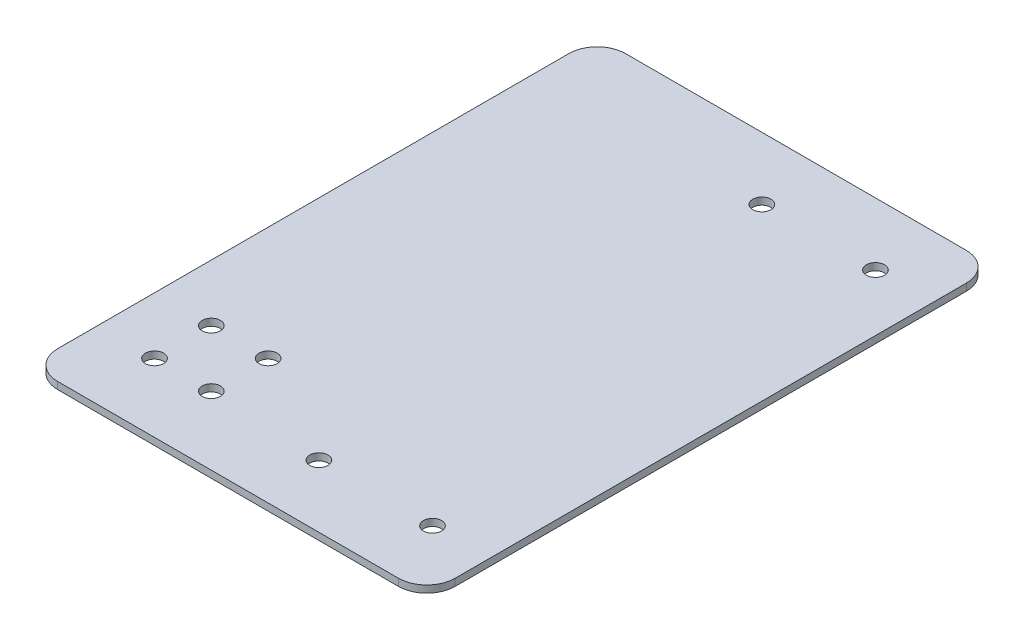
ISO-10303-21;
HEADER;
FILE_DESCRIPTION(('STEP AP214'),'2;1');
FILE_NAME('part.step','',(''),(''),'','','');
FILE_SCHEMA(('AUTOMOTIVE_DESIGN { 1 0 10303 214 1 1 1 1 }'));
ENDSEC;
DATA;
#1=APPLICATION_CONTEXT('core data for automotive mechanical design processes');
#2=APPLICATION_PROTOCOL_DEFINITION('international standard','automotive_design',2000,#1);
#3=PRODUCT_CONTEXT('',#1,'mechanical');
#4=PRODUCT('Part','Part','',(#3));
#5=PRODUCT_RELATED_PRODUCT_CATEGORY('part','',(#4));
#6=PRODUCT_DEFINITION_FORMATION('','',#4);
#7=PRODUCT_DEFINITION_CONTEXT('part definition',#1,'design');
#8=PRODUCT_DEFINITION('design','',#6,#7);
#9=PRODUCT_DEFINITION_SHAPE('','',#8);
#10=(LENGTH_UNIT() NAMED_UNIT(*) SI_UNIT(.MILLI.,.METRE.));
#11=(NAMED_UNIT(*) PLANE_ANGLE_UNIT() SI_UNIT($,.RADIAN.));
#12=(NAMED_UNIT(*) SI_UNIT($,.STERADIAN.) SOLID_ANGLE_UNIT());
#13=UNCERTAINTY_MEASURE_WITH_UNIT(LENGTH_MEASURE(1.E-05),#10,'distance_accuracy_value','');
#14=(GEOMETRIC_REPRESENTATION_CONTEXT(3) GLOBAL_UNCERTAINTY_ASSIGNED_CONTEXT((#13)) GLOBAL_UNIT_ASSIGNED_CONTEXT((#10,
#11,#12)) REPRESENTATION_CONTEXT('',''));
#15=CARTESIAN_POINT('',(0.,0.,0.));
#16=DIRECTION('',(0.,0.,1.));
#17=DIRECTION('',(1.,0.,0.));
#18=AXIS2_PLACEMENT_3D('',#15,#16,#17);
#19=CARTESIAN_POINT('',(0.,1.5875,-63.5));
#20=DIRECTION('',(0.,0.,-1.));
#21=DIRECTION('',(-1.,0.,0.));
#22=AXIS2_PLACEMENT_3D('',#19,#20,#21);
#23=PLANE('',#22);
#24=DIRECTION('',(1.,0.,0.));
#25=VECTOR('',#24,1.);
#26=CARTESIAN_POINT('',(0.,1.5875,-63.5));
#27=LINE('',#26,#25);
#28=CARTESIAN_POINT('',(38.1,1.5875,-63.5));
#29=VERTEX_POINT('',#28);
#30=CARTESIAN_POINT('',(114.3,1.5875,-63.5));
#31=VERTEX_POINT('',#30);
#32=EDGE_CURVE('E137',#29,#31,#27,.T.);
#33=ORIENTED_EDGE('',*,*,#32,.T.);
#34=DIRECTION('',(0.,-1.,0.));
#35=VECTOR('',#34,1.);
#36=CARTESIAN_POINT('',(114.3,1.5875,-63.5));
#37=LINE('',#36,#35);
#38=CARTESIAN_POINT('',(114.3,0.,-63.5));
#39=VERTEX_POINT('',#38);
#40=EDGE_CURVE('E130',#31,#39,#37,.T.);
#41=ORIENTED_EDGE('',*,*,#40,.T.);
#42=DIRECTION('',(1.,0.,0.));
#43=VECTOR('',#42,1.);
#44=CARTESIAN_POINT('',(0.,0.,-63.5));
#45=LINE('',#44,#43);
#46=CARTESIAN_POINT('',(38.1,0.,-63.5));
#47=VERTEX_POINT('',#46);
#48=EDGE_CURVE('E111',#47,#39,#45,.T.);
#49=ORIENTED_EDGE('',*,*,#48,.F.);
#50=DIRECTION('',(0.,1.,0.));
#51=VECTOR('',#50,1.);
#52=CARTESIAN_POINT('',(38.1,1.5875,-63.5));
#53=LINE('',#52,#51);
#54=EDGE_CURVE('E121',#47,#29,#53,.T.);
#55=ORIENTED_EDGE('',*,*,#54,.T.);
#56=EDGE_LOOP('',(#33,#41,#49,#55));
#57=FACE_BOUND('',#56,.T.);
#58=ADVANCED_FACE('F45',(#57),#23,.T.);
#59=CARTESIAN_POINT('',(0.,1.5875,63.5));
#60=DIRECTION('',(0.,0.,-1.));
#61=DIRECTION('',(-1.,0.,0.));
#62=AXIS2_PLACEMENT_3D('',#59,#60,#61);
#63=PLANE('',#62);
#64=DIRECTION('',(1.,0.,0.));
#65=VECTOR('',#64,1.);
#66=CARTESIAN_POINT('',(0.,0.,63.5));
#67=LINE('',#66,#65);
#68=CARTESIAN_POINT('',(38.1,0.,63.5));
#69=VERTEX_POINT('',#68);
#70=CARTESIAN_POINT('',(114.3,0.,63.5));
#71=VERTEX_POINT('',#70);
#72=EDGE_CURVE('E129',#69,#71,#67,.T.);
#73=ORIENTED_EDGE('',*,*,#72,.T.);
#74=DIRECTION('',(0.,-1.,0.));
#75=VECTOR('',#74,1.);
#76=CARTESIAN_POINT('',(114.3,1.5875,63.5));
#77=LINE('',#76,#75);
#78=CARTESIAN_POINT('',(114.3,1.5875,63.5));
#79=VERTEX_POINT('',#78);
#80=EDGE_CURVE('E60',#71,#79,#77,.F.);
#81=ORIENTED_EDGE('',*,*,#80,.T.);
#82=DIRECTION('',(1.,0.,0.));
#83=VECTOR('',#82,1.);
#84=CARTESIAN_POINT('',(0.,1.5875,63.5));
#85=LINE('',#84,#83);
#86=CARTESIAN_POINT('',(38.1,1.5875,63.5));
#87=VERTEX_POINT('',#86);
#88=EDGE_CURVE('E132',#87,#79,#85,.T.);
#89=ORIENTED_EDGE('',*,*,#88,.F.);
#90=DIRECTION('',(0.,1.,0.));
#91=VECTOR('',#90,1.);
#92=CARTESIAN_POINT('',(38.1,0.,63.5));
#93=LINE('',#92,#91);
#94=EDGE_CURVE('E151',#87,#69,#93,.F.);
#95=ORIENTED_EDGE('',*,*,#94,.T.);
#96=EDGE_LOOP('',(#73,#81,#89,#95));
#97=FACE_BOUND('',#96,.T.);
#98=ADVANCED_FACE('F243',(#97),#63,.F.);
#99=CARTESIAN_POINT('',(0.,1.5875,0.));
#100=DIRECTION('',(0.,1.,0.));
#101=DIRECTION('',(0.,0.,1.));
#102=AXIS2_PLACEMENT_3D('',#99,#100,#101);
#103=PLANE('',#102);
#104=CARTESIAN_POINT('',(57.15,1.5875,48.1965));
#105=DIRECTION('',(0.,1.,0.));
#106=DIRECTION('',(0.,0.,1.));
#107=AXIS2_PLACEMENT_3D('',#104,#105,#106);
#108=CIRCLE('',#107,2.032);
#109=CARTESIAN_POINT('',(57.15,1.5875,50.2285));
#110=VERTEX_POINT('',#109);
#111=EDGE_CURVE('E171',#110,#110,#108,.T.);
#112=ORIENTED_EDGE('',*,*,#111,.F.);
#113=EDGE_LOOP('',(#112));
#114=FACE_BOUND('',#113,.T.);
#115=CARTESIAN_POINT('',(44.45,1.5875,48.1965));
#116=DIRECTION('',(0.,1.,0.));
#117=DIRECTION('',(0.,0.,1.));
#118=AXIS2_PLACEMENT_3D('',#115,#116,#117);
#119=CIRCLE('',#118,2.032);
#120=CARTESIAN_POINT('',(44.45,1.5875,50.2285));
#121=VERTEX_POINT('',#120);
#122=EDGE_CURVE('E172',#121,#121,#119,.T.);
#123=ORIENTED_EDGE('',*,*,#122,.F.);
#124=EDGE_LOOP('',(#123));
#125=FACE_BOUND('',#124,.T.);
#126=CARTESIAN_POINT('',(44.45,1.5875,35.4965));
#127=DIRECTION('',(0.,1.,0.));
#128=DIRECTION('',(0.,0.,1.));
#129=AXIS2_PLACEMENT_3D('',#126,#127,#128);
#130=CIRCLE('',#129,2.03200000000002);
#131=CARTESIAN_POINT('',(44.45,1.5875,37.5285));
#132=VERTEX_POINT('',#131);
#133=EDGE_CURVE('E180',#132,#132,#130,.T.);
#134=ORIENTED_EDGE('',*,*,#133,.F.);
#135=EDGE_LOOP('',(#134));
#136=FACE_BOUND('',#135,.T.);
#137=CARTESIAN_POINT('',(57.15,1.5875,35.4965));
#138=DIRECTION('',(0.,1.,0.));
#139=DIRECTION('',(0.,0.,1.));
#140=AXIS2_PLACEMENT_3D('',#137,#138,#139);
#141=CIRCLE('',#140,2.03200000000001);
#142=CARTESIAN_POINT('',(57.15,1.5875,37.5285));
#143=VERTEX_POINT('',#142);
#144=EDGE_CURVE('E179',#143,#143,#141,.T.);
#145=ORIENTED_EDGE('',*,*,#144,.F.);
#146=EDGE_LOOP('',(#145));
#147=FACE_BOUND('',#146,.T.);
#148=CARTESIAN_POINT('',(107.95,1.5875,-49.53));
#149=DIRECTION('',(0.,1.,0.));
#150=DIRECTION('',(0.,0.,1.));
#151=AXIS2_PLACEMENT_3D('',#148,#149,#150);
#152=CIRCLE('',#151,2.03200000000001);
#153=CARTESIAN_POINT('',(107.95,1.5875,-47.498));
#154=VERTEX_POINT('',#153);
#155=EDGE_CURVE('E182',#154,#154,#152,.T.);
#156=ORIENTED_EDGE('',*,*,#155,.F.);
#157=EDGE_LOOP('',(#156));
#158=FACE_BOUND('',#157,.T.);
#159=CARTESIAN_POINT('',(107.95,1.5875,49.53));
#160=DIRECTION('',(0.,1.,0.));
#161=DIRECTION('',(0.,0.,1.));
#162=AXIS2_PLACEMENT_3D('',#159,#160,#161);
#163=CIRCLE('',#162,2.03200000000001);
#164=CARTESIAN_POINT('',(107.95,1.5875,51.562));
#165=VERTEX_POINT('',#164);
#166=EDGE_CURVE('E187',#165,#165,#163,.T.);
#167=ORIENTED_EDGE('',*,*,#166,.F.);
#168=EDGE_LOOP('',(#167));
#169=FACE_BOUND('',#168,.T.);
#170=CARTESIAN_POINT('',(82.55,1.5875,49.53));
#171=DIRECTION('',(0.,1.,0.));
#172=DIRECTION('',(0.,0.,1.));
#173=AXIS2_PLACEMENT_3D('',#170,#171,#172);
#174=CIRCLE('',#173,2.03200000000001);
#175=CARTESIAN_POINT('',(82.55,1.5875,51.562));
#176=VERTEX_POINT('',#175);
#177=EDGE_CURVE('E186',#176,#176,#174,.T.);
#178=ORIENTED_EDGE('',*,*,#177,.F.);
#179=EDGE_LOOP('',(#178));
#180=FACE_BOUND('',#179,.T.);
#181=CARTESIAN_POINT('',(82.55,1.5875,-49.53));
#182=DIRECTION('',(0.,1.,0.));
#183=DIRECTION('',(0.,0.,1.));
#184=AXIS2_PLACEMENT_3D('',#181,#182,#183);
#185=CIRCLE('',#184,2.03200000000001);
#186=CARTESIAN_POINT('',(82.55,1.5875,-47.498));
#187=VERTEX_POINT('',#186);
#188=EDGE_CURVE('E195',#187,#187,#185,.T.);
#189=ORIENTED_EDGE('',*,*,#188,.F.);
#190=EDGE_LOOP('',(#189));
#191=FACE_BOUND('',#190,.T.);
#192=DIRECTION('',(0.,0.,1.));
#193=VECTOR('',#192,1.);
#194=CARTESIAN_POINT('',(120.65,1.5875,0.));
#195=LINE('',#194,#193);
#196=CARTESIAN_POINT('',(120.65,1.5875,-57.15));
#197=VERTEX_POINT('',#196);
#198=CARTESIAN_POINT('',(120.65,1.5875,57.15));
#199=VERTEX_POINT('',#198);
#200=EDGE_CURVE('E193',#197,#199,#195,.T.);
#201=ORIENTED_EDGE('',*,*,#200,.F.);
#202=CARTESIAN_POINT('',(114.3,1.5875,-57.15));
#203=DIRECTION('',(0.,1.,0.));
#204=DIRECTION('',(0.,0.,1.));
#205=AXIS2_PLACEMENT_3D('',#202,#203,#204);
#206=CIRCLE('',#205,6.35);
#207=EDGE_CURVE('E152',#197,#31,#206,.T.);
#208=ORIENTED_EDGE('',*,*,#207,.T.);
#209=ORIENTED_EDGE('',*,*,#32,.F.);
#210=CARTESIAN_POINT('',(38.1,1.5875,-57.15));
#211=DIRECTION('',(0.,1.,0.));
#212=DIRECTION('',(0.,0.,1.));
#213=AXIS2_PLACEMENT_3D('',#210,#211,#212);
#214=CIRCLE('',#213,6.35);
#215=CARTESIAN_POINT('',(31.75,1.5875,-57.15));
#216=VERTEX_POINT('',#215);
#217=EDGE_CURVE('E134',#29,#216,#214,.T.);
#218=ORIENTED_EDGE('',*,*,#217,.T.);
#219=DIRECTION('',(0.,0.,1.));
#220=VECTOR('',#219,1.);
#221=CARTESIAN_POINT('',(31.75,1.5875,0.));
#222=LINE('',#221,#220);
#223=CARTESIAN_POINT('',(31.75,1.5875,57.15));
#224=VERTEX_POINT('',#223);
#225=EDGE_CURVE('E162',#216,#224,#222,.T.);
#226=ORIENTED_EDGE('',*,*,#225,.T.);
#227=CARTESIAN_POINT('',(38.1,1.5875,57.15));
#228=DIRECTION('',(0.,1.,0.));
#229=DIRECTION('',(0.,0.,1.));
#230=AXIS2_PLACEMENT_3D('',#227,#228,#229);
#231=CIRCLE('',#230,6.35);
#232=EDGE_CURVE('E61',#224,#87,#231,.T.);
#233=ORIENTED_EDGE('',*,*,#232,.T.);
#234=ORIENTED_EDGE('',*,*,#88,.T.);
#235=CARTESIAN_POINT('',(114.3,1.5875,57.15));
#236=DIRECTION('',(0.,1.,0.));
#237=DIRECTION('',(0.,0.,1.));
#238=AXIS2_PLACEMENT_3D('',#235,#236,#237);
#239=CIRCLE('',#238,6.35);
#240=EDGE_CURVE('E153',#79,#199,#239,.T.);
#241=ORIENTED_EDGE('',*,*,#240,.T.);
#242=EDGE_LOOP('',(#201,#208,#209,#218,#226,#233,#234,#241));
#243=FACE_BOUND('',#242,.T.);
#244=ADVANCED_FACE('F168',(#114,#125,#136,#147,#158,#169,#180,#191,#243),#103,.T.);
#245=CARTESIAN_POINT('',(0.,0.,0.));
#246=DIRECTION('',(0.,1.,0.));
#247=DIRECTION('',(0.,0.,1.));
#248=AXIS2_PLACEMENT_3D('',#245,#246,#247);
#249=PLANE('',#248);
#250=CARTESIAN_POINT('',(82.55,0.,-49.53));
#251=DIRECTION('',(0.,1.,0.));
#252=DIRECTION('',(0.,0.,1.));
#253=AXIS2_PLACEMENT_3D('',#250,#251,#252);
#254=CIRCLE('',#253,2.03200000000001);
#255=CARTESIAN_POINT('',(82.55,0.,-47.498));
#256=VERTEX_POINT('',#255);
#257=EDGE_CURVE('E220',#256,#256,#254,.T.);
#258=ORIENTED_EDGE('',*,*,#257,.T.);
#259=EDGE_LOOP('',(#258));
#260=FACE_BOUND('',#259,.T.);
#261=CARTESIAN_POINT('',(82.55,0.,49.53));
#262=DIRECTION('',(0.,1.,0.));
#263=DIRECTION('',(0.,0.,1.));
#264=AXIS2_PLACEMENT_3D('',#261,#262,#263);
#265=CIRCLE('',#264,2.03200000000001);
#266=CARTESIAN_POINT('',(82.55,0.,51.562));
#267=VERTEX_POINT('',#266);
#268=EDGE_CURVE('E218',#267,#267,#265,.T.);
#269=ORIENTED_EDGE('',*,*,#268,.T.);
#270=EDGE_LOOP('',(#269));
#271=FACE_BOUND('',#270,.T.);
#272=CARTESIAN_POINT('',(107.95,0.,49.53));
#273=DIRECTION('',(0.,1.,0.));
#274=DIRECTION('',(0.,0.,1.));
#275=AXIS2_PLACEMENT_3D('',#272,#273,#274);
#276=CIRCLE('',#275,2.03200000000001);
#277=CARTESIAN_POINT('',(107.95,0.,51.562));
#278=VERTEX_POINT('',#277);
#279=EDGE_CURVE('E214',#278,#278,#276,.T.);
#280=ORIENTED_EDGE('',*,*,#279,.T.);
#281=EDGE_LOOP('',(#280));
#282=FACE_BOUND('',#281,.T.);
#283=CARTESIAN_POINT('',(107.95,0.,-49.53));
#284=DIRECTION('',(0.,1.,0.));
#285=DIRECTION('',(0.,0.,1.));
#286=AXIS2_PLACEMENT_3D('',#283,#284,#285);
#287=CIRCLE('',#286,2.03200000000001);
#288=CARTESIAN_POINT('',(107.95,0.,-47.498));
#289=VERTEX_POINT('',#288);
#290=EDGE_CURVE('E208',#289,#289,#287,.T.);
#291=ORIENTED_EDGE('',*,*,#290,.T.);
#292=EDGE_LOOP('',(#291));
#293=FACE_BOUND('',#292,.T.);
#294=CARTESIAN_POINT('',(57.15,0.,35.4965));
#295=DIRECTION('',(0.,1.,0.));
#296=DIRECTION('',(0.,0.,1.));
#297=AXIS2_PLACEMENT_3D('',#294,#295,#296);
#298=CIRCLE('',#297,2.03200000000001);
#299=CARTESIAN_POINT('',(57.15,0.,37.5285));
#300=VERTEX_POINT('',#299);
#301=EDGE_CURVE('E210',#300,#300,#298,.T.);
#302=ORIENTED_EDGE('',*,*,#301,.T.);
#303=EDGE_LOOP('',(#302));
#304=FACE_BOUND('',#303,.T.);
#305=CARTESIAN_POINT('',(44.45,0.,35.4965));
#306=DIRECTION('',(0.,1.,0.));
#307=DIRECTION('',(0.,0.,1.));
#308=AXIS2_PLACEMENT_3D('',#305,#306,#307);
#309=CIRCLE('',#308,2.03200000000002);
#310=CARTESIAN_POINT('',(44.45,0.,37.5285));
#311=VERTEX_POINT('',#310);
#312=EDGE_CURVE('E201',#311,#311,#309,.T.);
#313=ORIENTED_EDGE('',*,*,#312,.T.);
#314=EDGE_LOOP('',(#313));
#315=FACE_BOUND('',#314,.T.);
#316=CARTESIAN_POINT('',(44.45,0.,48.1965));
#317=DIRECTION('',(0.,1.,0.));
#318=DIRECTION('',(0.,0.,1.));
#319=AXIS2_PLACEMENT_3D('',#316,#317,#318);
#320=CIRCLE('',#319,2.032);
#321=CARTESIAN_POINT('',(44.45,0.,50.2285));
#322=VERTEX_POINT('',#321);
#323=EDGE_CURVE('E202',#322,#322,#320,.T.);
#324=ORIENTED_EDGE('',*,*,#323,.T.);
#325=EDGE_LOOP('',(#324));
#326=FACE_BOUND('',#325,.T.);
#327=CARTESIAN_POINT('',(57.15,0.,48.1965));
#328=DIRECTION('',(0.,1.,0.));
#329=DIRECTION('',(0.,0.,1.));
#330=AXIS2_PLACEMENT_3D('',#327,#328,#329);
#331=CIRCLE('',#330,2.032);
#332=CARTESIAN_POINT('',(57.15,0.,50.2285));
#333=VERTEX_POINT('',#332);
#334=EDGE_CURVE('E166',#333,#333,#331,.T.);
#335=ORIENTED_EDGE('',*,*,#334,.T.);
#336=EDGE_LOOP('',(#335));
#337=FACE_BOUND('',#336,.T.);
#338=ORIENTED_EDGE('',*,*,#48,.T.);
#339=CARTESIAN_POINT('',(114.3,0.,-57.15));
#340=DIRECTION('',(0.,1.,0.));
#341=DIRECTION('',(0.,0.,1.));
#342=AXIS2_PLACEMENT_3D('',#339,#340,#341);
#343=CIRCLE('',#342,6.35);
#344=CARTESIAN_POINT('',(120.65,0.,-57.15));
#345=VERTEX_POINT('',#344);
#346=EDGE_CURVE('E145',#39,#345,#343,.F.);
#347=ORIENTED_EDGE('',*,*,#346,.T.);
#348=DIRECTION('',(0.,0.,1.));
#349=VECTOR('',#348,1.);
#350=CARTESIAN_POINT('',(120.65,0.,0.));
#351=LINE('',#350,#349);
#352=CARTESIAN_POINT('',(120.65,0.,57.15));
#353=VERTEX_POINT('',#352);
#354=EDGE_CURVE('E126',#345,#353,#351,.T.);
#355=ORIENTED_EDGE('',*,*,#354,.T.);
#356=CARTESIAN_POINT('',(114.3,0.,57.15));
#357=DIRECTION('',(0.,1.,0.));
#358=DIRECTION('',(0.,0.,1.));
#359=AXIS2_PLACEMENT_3D('',#356,#357,#358);
#360=CIRCLE('',#359,6.35);
#361=EDGE_CURVE('E120',#353,#71,#360,.F.);
#362=ORIENTED_EDGE('',*,*,#361,.T.);
#363=ORIENTED_EDGE('',*,*,#72,.F.);
#364=CARTESIAN_POINT('',(38.1,0.,57.15));
#365=DIRECTION('',(0.,1.,0.));
#366=DIRECTION('',(0.,0.,1.));
#367=AXIS2_PLACEMENT_3D('',#364,#365,#366);
#368=CIRCLE('',#367,6.35);
#369=CARTESIAN_POINT('',(31.75,0.,57.15));
#370=VERTEX_POINT('',#369);
#371=EDGE_CURVE('E117',#69,#370,#368,.F.);
#372=ORIENTED_EDGE('',*,*,#371,.T.);
#373=DIRECTION('',(0.,0.,1.));
#374=VECTOR('',#373,1.);
#375=CARTESIAN_POINT('',(31.75,0.,0.));
#376=LINE('',#375,#374);
#377=CARTESIAN_POINT('',(31.75,0.,-57.15));
#378=VERTEX_POINT('',#377);
#379=EDGE_CURVE('E113',#378,#370,#376,.T.);
#380=ORIENTED_EDGE('',*,*,#379,.F.);
#381=CARTESIAN_POINT('',(38.1,0.,-57.15));
#382=DIRECTION('',(0.,1.,0.));
#383=DIRECTION('',(0.,0.,1.));
#384=AXIS2_PLACEMENT_3D('',#381,#382,#383);
#385=CIRCLE('',#384,6.35);
#386=EDGE_CURVE('E108',#378,#47,#385,.F.);
#387=ORIENTED_EDGE('',*,*,#386,.T.);
#388=EDGE_LOOP('',(#338,#347,#355,#362,#363,#372,#380,#387));
#389=FACE_BOUND('',#388,.T.);
#390=ADVANCED_FACE('F109',(#260,#271,#282,#293,#304,#315,#326,#337,#389),#249,.F.);
#391=CARTESIAN_POINT('',(120.65,1.5875,0.));
#392=DIRECTION('',(1.,0.,0.));
#393=DIRECTION('',(0.,0.,-1.));
#394=AXIS2_PLACEMENT_3D('',#391,#392,#393);
#395=PLANE('',#394);
#396=ORIENTED_EDGE('',*,*,#354,.F.);
#397=DIRECTION('',(0.,-1.,0.));
#398=VECTOR('',#397,1.);
#399=CARTESIAN_POINT('',(120.65,1.5875,-57.15));
#400=LINE('',#399,#398);
#401=EDGE_CURVE('E150',#345,#197,#400,.F.);
#402=ORIENTED_EDGE('',*,*,#401,.T.);
#403=ORIENTED_EDGE('',*,*,#200,.T.);
#404=DIRECTION('',(0.,-1.,0.));
#405=VECTOR('',#404,1.);
#406=CARTESIAN_POINT('',(120.65,0.,57.15));
#407=LINE('',#406,#405);
#408=EDGE_CURVE('E144',#199,#353,#407,.T.);
#409=ORIENTED_EDGE('',*,*,#408,.T.);
#410=EDGE_LOOP('',(#396,#402,#403,#409));
#411=FACE_BOUND('',#410,.T.);
#412=ADVANCED_FACE('F227',(#411),#395,.T.);
#413=CARTESIAN_POINT('',(82.55,1.5875,-49.53));
#414=DIRECTION('',(0.,-1.,0.));
#415=DIRECTION('',(0.,0.,-1.));
#416=AXIS2_PLACEMENT_3D('',#413,#414,#415);
#417=CYLINDRICAL_SURFACE('',#416,2.03200000000001);
#418=ORIENTED_EDGE('',*,*,#188,.T.);
#419=EDGE_LOOP('',(#418));
#420=FACE_BOUND('',#419,.T.);
#421=ORIENTED_EDGE('',*,*,#257,.F.);
#422=EDGE_LOOP('',(#421));
#423=FACE_BOUND('',#422,.T.);
#424=ADVANCED_FACE('F251',(#420,#423),#417,.F.);
#425=CARTESIAN_POINT('',(82.55,1.5875,49.53));
#426=DIRECTION('',(0.,-1.,0.));
#427=DIRECTION('',(0.,0.,-1.));
#428=AXIS2_PLACEMENT_3D('',#425,#426,#427);
#429=CYLINDRICAL_SURFACE('',#428,2.03200000000001);
#430=ORIENTED_EDGE('',*,*,#177,.T.);
#431=EDGE_LOOP('',(#430));
#432=FACE_BOUND('',#431,.T.);
#433=ORIENTED_EDGE('',*,*,#268,.F.);
#434=EDGE_LOOP('',(#433));
#435=FACE_BOUND('',#434,.T.);
#436=ADVANCED_FACE('F260',(#432,#435),#429,.F.);
#437=CARTESIAN_POINT('',(107.95,1.5875,49.53));
#438=DIRECTION('',(0.,-1.,0.));
#439=DIRECTION('',(0.,0.,-1.));
#440=AXIS2_PLACEMENT_3D('',#437,#438,#439);
#441=CYLINDRICAL_SURFACE('',#440,2.03200000000001);
#442=ORIENTED_EDGE('',*,*,#166,.T.);
#443=EDGE_LOOP('',(#442));
#444=FACE_BOUND('',#443,.T.);
#445=ORIENTED_EDGE('',*,*,#279,.F.);
#446=EDGE_LOOP('',(#445));
#447=FACE_BOUND('',#446,.T.);
#448=ADVANCED_FACE('F263',(#444,#447),#441,.F.);
#449=CARTESIAN_POINT('',(107.95,1.5875,-49.53));
#450=DIRECTION('',(0.,-1.,0.));
#451=DIRECTION('',(0.,0.,-1.));
#452=AXIS2_PLACEMENT_3D('',#449,#450,#451);
#453=CYLINDRICAL_SURFACE('',#452,2.03200000000001);
#454=ORIENTED_EDGE('',*,*,#155,.T.);
#455=EDGE_LOOP('',(#454));
#456=FACE_BOUND('',#455,.T.);
#457=ORIENTED_EDGE('',*,*,#290,.F.);
#458=EDGE_LOOP('',(#457));
#459=FACE_BOUND('',#458,.T.);
#460=ADVANCED_FACE('F261',(#456,#459),#453,.F.);
#461=CARTESIAN_POINT('',(57.15,1.5875,35.4965));
#462=DIRECTION('',(0.,-1.,0.));
#463=DIRECTION('',(0.,0.,-1.));
#464=AXIS2_PLACEMENT_3D('',#461,#462,#463);
#465=CYLINDRICAL_SURFACE('',#464,2.03200000000001);
#466=ORIENTED_EDGE('',*,*,#144,.T.);
#467=EDGE_LOOP('',(#466));
#468=FACE_BOUND('',#467,.T.);
#469=ORIENTED_EDGE('',*,*,#301,.F.);
#470=EDGE_LOOP('',(#469));
#471=FACE_BOUND('',#470,.T.);
#472=ADVANCED_FACE('F266',(#468,#471),#465,.F.);
#473=CARTESIAN_POINT('',(44.45,1.5875,35.4965));
#474=DIRECTION('',(0.,-1.,0.));
#475=DIRECTION('',(0.,0.,-1.));
#476=AXIS2_PLACEMENT_3D('',#473,#474,#475);
#477=CYLINDRICAL_SURFACE('',#476,2.03200000000002);
#478=ORIENTED_EDGE('',*,*,#133,.T.);
#479=EDGE_LOOP('',(#478));
#480=FACE_BOUND('',#479,.T.);
#481=ORIENTED_EDGE('',*,*,#312,.F.);
#482=EDGE_LOOP('',(#481));
#483=FACE_BOUND('',#482,.T.);
#484=ADVANCED_FACE('F271',(#480,#483),#477,.F.);
#485=CARTESIAN_POINT('',(44.45,1.5875,48.1965));
#486=DIRECTION('',(0.,-1.,0.));
#487=DIRECTION('',(0.,0.,-1.));
#488=AXIS2_PLACEMENT_3D('',#485,#486,#487);
#489=CYLINDRICAL_SURFACE('',#488,2.032);
#490=ORIENTED_EDGE('',*,*,#122,.T.);
#491=EDGE_LOOP('',(#490));
#492=FACE_BOUND('',#491,.T.);
#493=ORIENTED_EDGE('',*,*,#323,.F.);
#494=EDGE_LOOP('',(#493));
#495=FACE_BOUND('',#494,.T.);
#496=ADVANCED_FACE('F280',(#492,#495),#489,.F.);
#497=CARTESIAN_POINT('',(57.15,1.5875,48.1965));
#498=DIRECTION('',(0.,-1.,0.));
#499=DIRECTION('',(0.,0.,-1.));
#500=AXIS2_PLACEMENT_3D('',#497,#498,#499);
#501=CYLINDRICAL_SURFACE('',#500,2.032);
#502=ORIENTED_EDGE('',*,*,#111,.T.);
#503=EDGE_LOOP('',(#502));
#504=FACE_BOUND('',#503,.T.);
#505=ORIENTED_EDGE('',*,*,#334,.F.);
#506=EDGE_LOOP('',(#505));
#507=FACE_BOUND('',#506,.T.);
#508=ADVANCED_FACE('F283',(#504,#507),#501,.F.);
#509=CARTESIAN_POINT('',(31.75,0.,0.));
#510=DIRECTION('',(-1.,0.,0.));
#511=DIRECTION('',(0.,0.,1.));
#512=AXIS2_PLACEMENT_3D('',#509,#510,#511);
#513=PLANE('',#512);
#514=ORIENTED_EDGE('',*,*,#225,.F.);
#515=DIRECTION('',(0.,1.,0.));
#516=VECTOR('',#515,1.);
#517=CARTESIAN_POINT('',(31.75,0.,-57.15));
#518=LINE('',#517,#516);
#519=EDGE_CURVE('E11',#216,#378,#518,.F.);
#520=ORIENTED_EDGE('',*,*,#519,.T.);
#521=ORIENTED_EDGE('',*,*,#379,.T.);
#522=DIRECTION('',(0.,1.,0.));
#523=VECTOR('',#522,1.);
#524=CARTESIAN_POINT('',(31.75,1.5875,57.15));
#525=LINE('',#524,#523);
#526=EDGE_CURVE('E49',#370,#224,#525,.T.);
#527=ORIENTED_EDGE('',*,*,#526,.T.);
#528=EDGE_LOOP('',(#514,#520,#521,#527));
#529=FACE_BOUND('',#528,.T.);
#530=ADVANCED_FACE('F163',(#529),#513,.T.);
#531=CARTESIAN_POINT('',(114.3,1.5875,-57.15));
#532=DIRECTION('',(0.,-1.,0.));
#533=DIRECTION('',(0.,0.,-1.));
#534=AXIS2_PLACEMENT_3D('',#531,#532,#533);
#535=CYLINDRICAL_SURFACE('',#534,6.35);
#536=ORIENTED_EDGE('',*,*,#207,.F.);
#537=ORIENTED_EDGE('',*,*,#401,.F.);
#538=ORIENTED_EDGE('',*,*,#346,.F.);
#539=ORIENTED_EDGE('',*,*,#40,.F.);
#540=EDGE_LOOP('',(#536,#537,#538,#539));
#541=FACE_BOUND('',#540,.T.);
#542=ADVANCED_FACE('F233',(#541),#535,.T.);
#543=CARTESIAN_POINT('',(114.3,1.5875,57.15));
#544=DIRECTION('',(0.,1.,0.));
#545=DIRECTION('',(0.,0.,1.));
#546=AXIS2_PLACEMENT_3D('',#543,#544,#545);
#547=CYLINDRICAL_SURFACE('',#546,6.35);
#548=ORIENTED_EDGE('',*,*,#240,.F.);
#549=ORIENTED_EDGE('',*,*,#80,.F.);
#550=ORIENTED_EDGE('',*,*,#361,.F.);
#551=ORIENTED_EDGE('',*,*,#408,.F.);
#552=EDGE_LOOP('',(#548,#549,#550,#551));
#553=FACE_BOUND('',#552,.T.);
#554=ADVANCED_FACE('F234',(#553),#547,.T.);
#555=CARTESIAN_POINT('',(38.1,1.5875,-57.15));
#556=DIRECTION('',(0.,1.,0.));
#557=DIRECTION('',(0.,0.,1.));
#558=AXIS2_PLACEMENT_3D('',#555,#556,#557);
#559=CYLINDRICAL_SURFACE('',#558,6.35);
#560=ORIENTED_EDGE('',*,*,#386,.F.);
#561=ORIENTED_EDGE('',*,*,#519,.F.);
#562=ORIENTED_EDGE('',*,*,#217,.F.);
#563=ORIENTED_EDGE('',*,*,#54,.F.);
#564=EDGE_LOOP('',(#560,#561,#562,#563));
#565=FACE_BOUND('',#564,.T.);
#566=ADVANCED_FACE('F133',(#565),#559,.T.);
#567=CARTESIAN_POINT('',(38.1,0.,57.15));
#568=DIRECTION('',(0.,-1.,0.));
#569=DIRECTION('',(0.,0.,-1.));
#570=AXIS2_PLACEMENT_3D('',#567,#568,#569);
#571=CYLINDRICAL_SURFACE('',#570,6.35);
#572=ORIENTED_EDGE('',*,*,#371,.F.);
#573=ORIENTED_EDGE('',*,*,#94,.F.);
#574=ORIENTED_EDGE('',*,*,#232,.F.);
#575=ORIENTED_EDGE('',*,*,#526,.F.);
#576=EDGE_LOOP('',(#572,#573,#574,#575));
#577=FACE_BOUND('',#576,.T.);
#578=ADVANCED_FACE('F42',(#577),#571,.T.);
#579=CLOSED_SHELL('',(#58,#98,#244,#390,#412,#424,#436,#448,#460,#472,#484,#496,#508,#530,#542,
#554,#566,#578));
#580=MANIFOLD_SOLID_BREP('B2',#579);
#581=ADVANCED_BREP_SHAPE_REPRESENTATION('',(#18,#580),#14);
#582=SHAPE_DEFINITION_REPRESENTATION(#9,#581);
ENDSEC;
END-ISO-10303-21;
